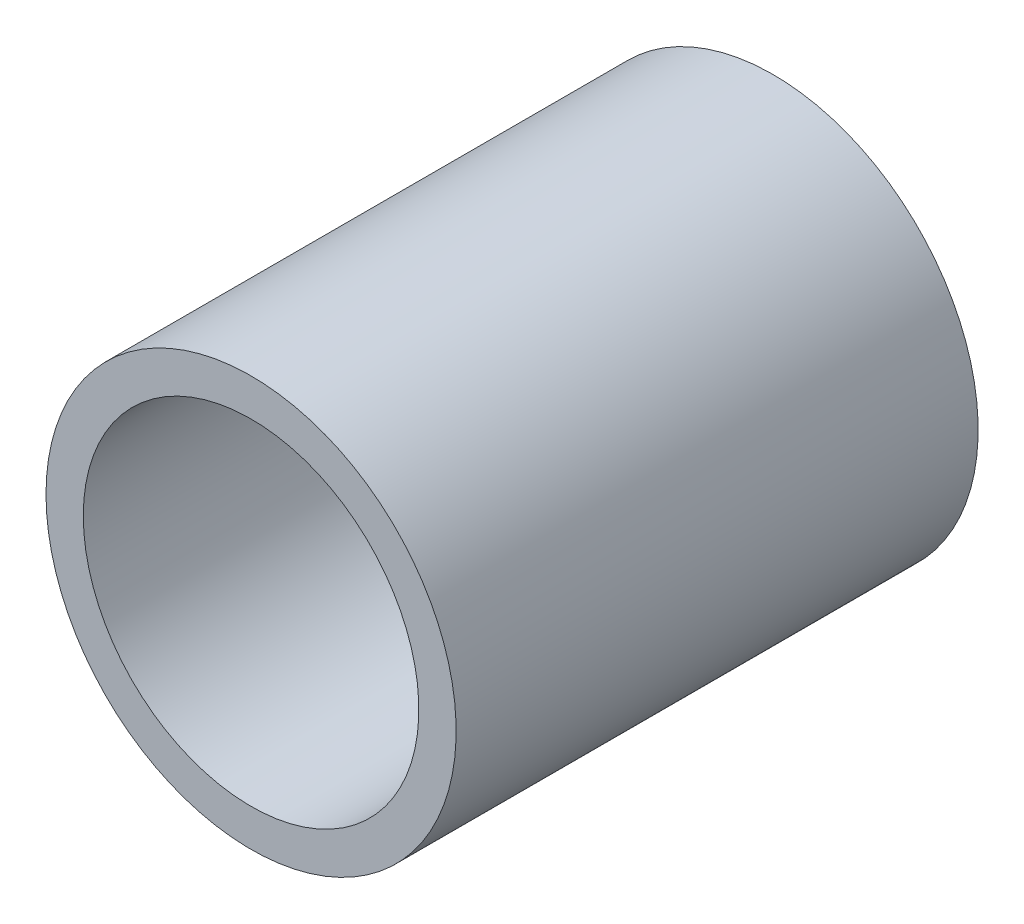
ISO-10303-21;
HEADER;
FILE_DESCRIPTION(('STEP AP214'),'2;1');
FILE_NAME('part.step','',(''),(''),'','','');
FILE_SCHEMA(('AUTOMOTIVE_DESIGN { 1 0 10303 214 1 1 1 1 }'));
ENDSEC;
DATA;
#1=APPLICATION_CONTEXT('core data for automotive mechanical design processes');
#2=APPLICATION_PROTOCOL_DEFINITION('international standard','automotive_design',2000,#1);
#3=PRODUCT_CONTEXT('',#1,'mechanical');
#4=PRODUCT('Part','Part','',(#3));
#5=PRODUCT_RELATED_PRODUCT_CATEGORY('part','',(#4));
#6=PRODUCT_DEFINITION_FORMATION('','',#4);
#7=PRODUCT_DEFINITION_CONTEXT('part definition',#1,'design');
#8=PRODUCT_DEFINITION('design','',#6,#7);
#9=PRODUCT_DEFINITION_SHAPE('','',#8);
#10=(LENGTH_UNIT() NAMED_UNIT(*) SI_UNIT(.MILLI.,.METRE.));
#11=(NAMED_UNIT(*) PLANE_ANGLE_UNIT() SI_UNIT($,.RADIAN.));
#12=(NAMED_UNIT(*) SI_UNIT($,.STERADIAN.) SOLID_ANGLE_UNIT());
#13=UNCERTAINTY_MEASURE_WITH_UNIT(LENGTH_MEASURE(1.E-05),#10,'distance_accuracy_value','');
#14=(GEOMETRIC_REPRESENTATION_CONTEXT(3) GLOBAL_UNCERTAINTY_ASSIGNED_CONTEXT((#13)) GLOBAL_UNIT_ASSIGNED_CONTEXT((#10,
#11,#12)) REPRESENTATION_CONTEXT('',''));
#15=CARTESIAN_POINT('',(0.,0.,0.));
#16=DIRECTION('',(0.,0.,1.));
#17=DIRECTION('',(1.,0.,0.));
#18=AXIS2_PLACEMENT_3D('',#15,#16,#17);
#19=CARTESIAN_POINT('',(0.,0.,14.));
#20=DIRECTION('',(0.,0.,1.));
#21=DIRECTION('',(1.,0.,0.));
#22=AXIS2_PLACEMENT_3D('',#19,#20,#21);
#23=PLANE('',#22);
#24=CARTESIAN_POINT('',(0.,0.,14.));
#25=DIRECTION('',(0.,0.,1.));
#26=DIRECTION('',(1.,0.,0.));
#27=AXIS2_PLACEMENT_3D('',#24,#25,#26);
#28=CIRCLE('',#27,5.5);
#29=CARTESIAN_POINT('',(-5.5,0.,14.));
#30=VERTEX_POINT('',#29);
#31=EDGE_CURVE('E10',#30,#30,#28,.T.);
#32=ORIENTED_EDGE('',*,*,#31,.T.);
#33=EDGE_LOOP('',(#32));
#34=FACE_BOUND('',#33,.T.);
#35=CARTESIAN_POINT('',(0.,0.,14.));
#36=DIRECTION('',(0.,0.,1.));
#37=DIRECTION('',(1.,0.,0.));
#38=AXIS2_PLACEMENT_3D('',#35,#36,#37);
#39=CIRCLE('',#38,4.5);
#40=CARTESIAN_POINT('',(-4.5,0.,14.));
#41=VERTEX_POINT('',#40);
#42=EDGE_CURVE('E48',#41,#41,#39,.T.);
#43=ORIENTED_EDGE('',*,*,#42,.F.);
#44=EDGE_LOOP('',(#43));
#45=FACE_BOUND('',#44,.T.);
#46=ADVANCED_FACE('F34',(#34,#45),#23,.T.);
#47=CARTESIAN_POINT('',(0.,0.,0.));
#48=DIRECTION('',(0.,0.,1.));
#49=DIRECTION('',(1.,0.,0.));
#50=AXIS2_PLACEMENT_3D('',#47,#48,#49);
#51=PLANE('',#50);
#52=CARTESIAN_POINT('',(0.,0.,0.));
#53=DIRECTION('',(0.,0.,1.));
#54=DIRECTION('',(1.,0.,0.));
#55=AXIS2_PLACEMENT_3D('',#52,#53,#54);
#56=CIRCLE('',#55,5.5);
#57=CARTESIAN_POINT('',(-5.5,0.,0.));
#58=VERTEX_POINT('',#57);
#59=EDGE_CURVE('E38',#58,#58,#56,.T.);
#60=ORIENTED_EDGE('',*,*,#59,.F.);
#61=EDGE_LOOP('',(#60));
#62=FACE_BOUND('',#61,.T.);
#63=CARTESIAN_POINT('',(0.,0.,0.));
#64=DIRECTION('',(0.,0.,1.));
#65=DIRECTION('',(1.,0.,0.));
#66=AXIS2_PLACEMENT_3D('',#63,#64,#65);
#67=CIRCLE('',#66,4.5);
#68=CARTESIAN_POINT('',(-4.5,0.,0.));
#69=VERTEX_POINT('',#68);
#70=EDGE_CURVE('E50',#69,#69,#67,.T.);
#71=ORIENTED_EDGE('',*,*,#70,.T.);
#72=EDGE_LOOP('',(#71));
#73=FACE_BOUND('',#72,.T.);
#74=ADVANCED_FACE('F63',(#62,#73),#51,.F.);
#75=CARTESIAN_POINT('',(0.,0.,14.));
#76=DIRECTION('',(0.,0.,-1.));
#77=DIRECTION('',(-1.,0.,0.));
#78=AXIS2_PLACEMENT_3D('',#75,#76,#77);
#79=CYLINDRICAL_SURFACE('',#78,5.5);
#80=CARTESIAN_POINT('',(-5.5,0.,14.));
#81=CARTESIAN_POINT('',(-5.5,0.,13.8541666666667));
#82=CARTESIAN_POINT('',(-5.5,0.,13.7083333333333));
#83=CARTESIAN_POINT('',(-5.5,0.,13.4166666666667));
#84=CARTESIAN_POINT('',(-5.5,0.,13.2708333333333));
#85=CARTESIAN_POINT('',(-5.5,0.,12.9791666666667));
#86=CARTESIAN_POINT('',(-5.5,0.,12.8333333333333));
#87=CARTESIAN_POINT('',(-5.5,0.,12.5416666666667));
#88=CARTESIAN_POINT('',(-5.5,0.,12.3958333333333));
#89=CARTESIAN_POINT('',(-5.5,0.,12.1041666666667));
#90=CARTESIAN_POINT('',(-5.5,0.,11.9583333333333));
#91=CARTESIAN_POINT('',(-5.5,0.,11.6666666666667));
#92=CARTESIAN_POINT('',(-5.5,0.,11.5208333333333));
#93=CARTESIAN_POINT('',(-5.5,0.,11.2291666666667));
#94=CARTESIAN_POINT('',(-5.5,0.,11.0833333333333));
#95=CARTESIAN_POINT('',(-5.5,0.,10.7916666666667));
#96=CARTESIAN_POINT('',(-5.5,0.,10.6458333333333));
#97=CARTESIAN_POINT('',(-5.5,0.,10.3541666666667));
#98=CARTESIAN_POINT('',(-5.5,0.,10.2083333333333));
#99=CARTESIAN_POINT('',(-5.5,0.,9.91666666666667));
#100=CARTESIAN_POINT('',(-5.5,0.,9.77083333333333));
#101=CARTESIAN_POINT('',(-5.5,0.,9.47916666666667));
#102=CARTESIAN_POINT('',(-5.5,0.,9.33333333333333));
#103=CARTESIAN_POINT('',(-5.5,0.,9.04166666666666));
#104=CARTESIAN_POINT('',(-5.5,0.,8.89583333333333));
#105=CARTESIAN_POINT('',(-5.5,0.,8.60416666666667));
#106=CARTESIAN_POINT('',(-5.5,0.,8.45833333333333));
#107=CARTESIAN_POINT('',(-5.5,0.,8.16666666666667));
#108=CARTESIAN_POINT('',(-5.5,0.,8.02083333333333));
#109=CARTESIAN_POINT('',(-5.5,0.,7.72916666666667));
#110=CARTESIAN_POINT('',(-5.5,0.,7.58333333333333));
#111=CARTESIAN_POINT('',(-5.5,0.,7.29166666666667));
#112=CARTESIAN_POINT('',(-5.5,0.,7.14583333333333));
#113=CARTESIAN_POINT('',(-5.5,0.,6.85416666666667));
#114=CARTESIAN_POINT('',(-5.5,0.,6.70833333333333));
#115=CARTESIAN_POINT('',(-5.5,0.,6.41666666666667));
#116=CARTESIAN_POINT('',(-5.5,0.,6.27083333333333));
#117=CARTESIAN_POINT('',(-5.5,0.,5.97916666666667));
#118=CARTESIAN_POINT('',(-5.5,0.,5.83333333333333));
#119=CARTESIAN_POINT('',(-5.5,0.,5.54166666666666));
#120=CARTESIAN_POINT('',(-5.5,0.,5.39583333333333));
#121=CARTESIAN_POINT('',(-5.5,0.,5.10416666666666));
#122=CARTESIAN_POINT('',(-5.5,0.,4.95833333333333));
#123=CARTESIAN_POINT('',(-5.5,0.,4.66666666666666));
#124=CARTESIAN_POINT('',(-5.5,0.,4.52083333333333));
#125=CARTESIAN_POINT('',(-5.5,0.,4.22916666666667));
#126=CARTESIAN_POINT('',(-5.5,0.,4.08333333333333));
#127=CARTESIAN_POINT('',(-5.5,0.,3.79166666666667));
#128=CARTESIAN_POINT('',(-5.5,0.,3.64583333333333));
#129=CARTESIAN_POINT('',(-5.5,0.,3.35416666666667));
#130=CARTESIAN_POINT('',(-5.5,0.,3.20833333333333));
#131=CARTESIAN_POINT('',(-5.5,0.,2.91666666666667));
#132=CARTESIAN_POINT('',(-5.5,0.,2.77083333333333));
#133=CARTESIAN_POINT('',(-5.5,0.,2.47916666666667));
#134=CARTESIAN_POINT('',(-5.5,0.,2.33333333333333));
#135=CARTESIAN_POINT('',(-5.5,0.,2.04166666666667));
#136=CARTESIAN_POINT('',(-5.5,0.,1.89583333333333));
#137=CARTESIAN_POINT('',(-5.5,0.,1.60416666666667));
#138=CARTESIAN_POINT('',(-5.5,0.,1.45833333333333));
#139=CARTESIAN_POINT('',(-5.5,0.,1.16666666666667));
#140=CARTESIAN_POINT('',(-5.5,0.,1.02083333333333));
#141=CARTESIAN_POINT('',(-5.5,0.,0.729166666666666));
#142=CARTESIAN_POINT('',(-5.5,0.,0.583333333333332));
#143=CARTESIAN_POINT('',(-5.5,0.,0.291666666666666));
#144=CARTESIAN_POINT('',(-5.5,0.,0.145833333333332));
#145=CARTESIAN_POINT('',(-5.5,0.,0.));
#146=B_SPLINE_CURVE_WITH_KNOTS('',3,(#80,#81,#82,#83,#84,#85,#86,#87,#88,#89,#90,#91,#92,#93,
#94,#95,#96,#97,#98,#99,#100,#101,#102,#103,#104,#105,#106,#107,#108,#109,#110,#111,#112,#113,
#114,#115,#116,#117,#118,#119,#120,#121,#122,#123,#124,#125,#126,#127,#128,#129,#130,#131,#132,
#133,#134,#135,#136,#137,#138,#139,#140,#141,#142,#143,#144,#145),.UNSPECIFIED.,.F.,.F.,(4,2,2,
2,2,2,2,2,2,2,2,2,2,2,2,2,2,2,2,2,2,2,2,2,2,2,2,2,2,2,2,2,4),(0.,0.437499999999999,
0.874999999999999,1.3125,1.75,2.1875,2.625,3.0625,3.5,3.9375,4.375,4.8125,5.25,5.6875,6.125,
6.5625,7.,7.4375,7.875,8.3125,8.75,9.1875,9.625,10.0625,10.5,10.9375,11.375,11.8125,12.25,
12.6875,13.125,13.5625,14.),.UNSPECIFIED.);
#147=EDGE_CURVE('BSEAM36',#30,#58,#146,.T.);
#148=ORIENTED_EDGE('',*,*,#31,.F.);
#149=ORIENTED_EDGE('',*,*,#59,.T.);
#150=ORIENTED_EDGE('',*,*,#147,.T.);
#151=ORIENTED_EDGE('',*,*,#147,.F.);
#152=EDGE_LOOP('',(#148,#150,#149,#151));
#153=FACE_BOUND('',#152,.T.);
#154=ADVANCED_FACE('F36',(#153),#79,.T.);
#155=CARTESIAN_POINT('',(0.,0.,14.));
#156=DIRECTION('',(0.,0.,-1.));
#157=DIRECTION('',(-1.,0.,0.));
#158=AXIS2_PLACEMENT_3D('',#155,#156,#157);
#159=CYLINDRICAL_SURFACE('',#158,4.5);
#160=CARTESIAN_POINT('',(-4.5,0.,14.));
#161=CARTESIAN_POINT('',(-4.5,0.,13.8541666666667));
#162=CARTESIAN_POINT('',(-4.5,0.,13.7083333333333));
#163=CARTESIAN_POINT('',(-4.5,0.,13.4166666666667));
#164=CARTESIAN_POINT('',(-4.5,0.,13.2708333333333));
#165=CARTESIAN_POINT('',(-4.5,0.,12.9791666666667));
#166=CARTESIAN_POINT('',(-4.5,0.,12.8333333333333));
#167=CARTESIAN_POINT('',(-4.5,0.,12.5416666666667));
#168=CARTESIAN_POINT('',(-4.5,0.,12.3958333333333));
#169=CARTESIAN_POINT('',(-4.5,0.,12.1041666666667));
#170=CARTESIAN_POINT('',(-4.5,0.,11.9583333333333));
#171=CARTESIAN_POINT('',(-4.5,0.,11.6666666666667));
#172=CARTESIAN_POINT('',(-4.5,0.,11.5208333333333));
#173=CARTESIAN_POINT('',(-4.5,0.,11.2291666666667));
#174=CARTESIAN_POINT('',(-4.5,0.,11.0833333333333));
#175=CARTESIAN_POINT('',(-4.5,0.,10.7916666666667));
#176=CARTESIAN_POINT('',(-4.5,0.,10.6458333333333));
#177=CARTESIAN_POINT('',(-4.5,0.,10.3541666666667));
#178=CARTESIAN_POINT('',(-4.5,0.,10.2083333333333));
#179=CARTESIAN_POINT('',(-4.5,0.,9.91666666666667));
#180=CARTESIAN_POINT('',(-4.5,0.,9.77083333333333));
#181=CARTESIAN_POINT('',(-4.5,0.,9.47916666666667));
#182=CARTESIAN_POINT('',(-4.5,0.,9.33333333333333));
#183=CARTESIAN_POINT('',(-4.5,0.,9.04166666666666));
#184=CARTESIAN_POINT('',(-4.5,0.,8.89583333333333));
#185=CARTESIAN_POINT('',(-4.5,0.,8.60416666666666));
#186=CARTESIAN_POINT('',(-4.5,0.,8.45833333333333));
#187=CARTESIAN_POINT('',(-4.5,0.,8.16666666666666));
#188=CARTESIAN_POINT('',(-4.5,0.,8.02083333333333));
#189=CARTESIAN_POINT('',(-4.5,0.,7.72916666666666));
#190=CARTESIAN_POINT('',(-4.5,0.,7.58333333333333));
#191=CARTESIAN_POINT('',(-4.5,0.,7.29166666666667));
#192=CARTESIAN_POINT('',(-4.5,0.,7.14583333333333));
#193=CARTESIAN_POINT('',(-4.5,0.,6.85416666666666));
#194=CARTESIAN_POINT('',(-4.5,0.,6.70833333333333));
#195=CARTESIAN_POINT('',(-4.5,0.,6.41666666666667));
#196=CARTESIAN_POINT('',(-4.5,0.,6.27083333333333));
#197=CARTESIAN_POINT('',(-4.5,0.,5.97916666666667));
#198=CARTESIAN_POINT('',(-4.5,0.,5.83333333333333));
#199=CARTESIAN_POINT('',(-4.5,0.,5.54166666666666));
#200=CARTESIAN_POINT('',(-4.5,0.,5.39583333333333));
#201=CARTESIAN_POINT('',(-4.5,0.,5.10416666666667));
#202=CARTESIAN_POINT('',(-4.5,0.,4.95833333333333));
#203=CARTESIAN_POINT('',(-4.5,0.,4.66666666666667));
#204=CARTESIAN_POINT('',(-4.5,0.,4.52083333333333));
#205=CARTESIAN_POINT('',(-4.5,0.,4.22916666666667));
#206=CARTESIAN_POINT('',(-4.5,0.,4.08333333333333));
#207=CARTESIAN_POINT('',(-4.5,0.,3.79166666666667));
#208=CARTESIAN_POINT('',(-4.5,0.,3.64583333333333));
#209=CARTESIAN_POINT('',(-4.5,0.,3.35416666666667));
#210=CARTESIAN_POINT('',(-4.5,0.,3.20833333333333));
#211=CARTESIAN_POINT('',(-4.5,0.,2.91666666666667));
#212=CARTESIAN_POINT('',(-4.5,0.,2.77083333333333));
#213=CARTESIAN_POINT('',(-4.5,0.,2.47916666666667));
#214=CARTESIAN_POINT('',(-4.5,0.,2.33333333333333));
#215=CARTESIAN_POINT('',(-4.5,0.,2.04166666666667));
#216=CARTESIAN_POINT('',(-4.5,0.,1.89583333333333));
#217=CARTESIAN_POINT('',(-4.5,0.,1.60416666666667));
#218=CARTESIAN_POINT('',(-4.5,0.,1.45833333333333));
#219=CARTESIAN_POINT('',(-4.5,0.,1.16666666666667));
#220=CARTESIAN_POINT('',(-4.5,0.,1.02083333333333));
#221=CARTESIAN_POINT('',(-4.5,0.,0.729166666666666));
#222=CARTESIAN_POINT('',(-4.5,0.,0.583333333333332));
#223=CARTESIAN_POINT('',(-4.5,0.,0.291666666666666));
#224=CARTESIAN_POINT('',(-4.5,0.,0.145833333333332));
#225=CARTESIAN_POINT('',(-4.5,0.,0.));
#226=B_SPLINE_CURVE_WITH_KNOTS('',3,(#160,#161,#162,#163,#164,#165,#166,#167,#168,#169,#170,
#171,#172,#173,#174,#175,#176,#177,#178,#179,#180,#181,#182,#183,#184,#185,#186,#187,#188,#189,
#190,#191,#192,#193,#194,#195,#196,#197,#198,#199,#200,#201,#202,#203,#204,#205,#206,#207,#208,
#209,#210,#211,#212,#213,#214,#215,#216,#217,#218,#219,#220,#221,#222,#223,#224,#225),
.UNSPECIFIED.,.F.,.F.,(4,2,2,2,2,2,2,2,2,2,2,2,2,2,2,2,2,2,2,2,2,2,2,2,2,2,2,2,2,2,2,2,4),(0.,
0.4375,0.875000000000001,1.3125,1.75,2.1875,2.625,3.0625,3.5,3.9375,4.375,4.8125,5.25,5.6875,
6.125,6.5625,7.,7.4375,7.875,8.3125,8.75,9.1875,9.625,10.0625,10.5,10.9375,11.375,11.8125,12.25,
12.6875,13.125,13.5625,14.),.UNSPECIFIED.);
#227=EDGE_CURVE('BSEAM59',#41,#69,#226,.T.);
#228=ORIENTED_EDGE('',*,*,#42,.T.);
#229=ORIENTED_EDGE('',*,*,#70,.F.);
#230=ORIENTED_EDGE('',*,*,#227,.T.);
#231=ORIENTED_EDGE('',*,*,#227,.F.);
#232=EDGE_LOOP('',(#228,#230,#229,#231));
#233=FACE_BOUND('',#232,.T.);
#234=ADVANCED_FACE('F59',(#233),#159,.F.);
#235=CLOSED_SHELL('',(#46,#74,#154,#234));
#236=MANIFOLD_SOLID_BREP('B2',#235);
#237=ADVANCED_BREP_SHAPE_REPRESENTATION('',(#18,#236),#14);
#238=SHAPE_DEFINITION_REPRESENTATION(#9,#237);
ENDSEC;
END-ISO-10303-21;
